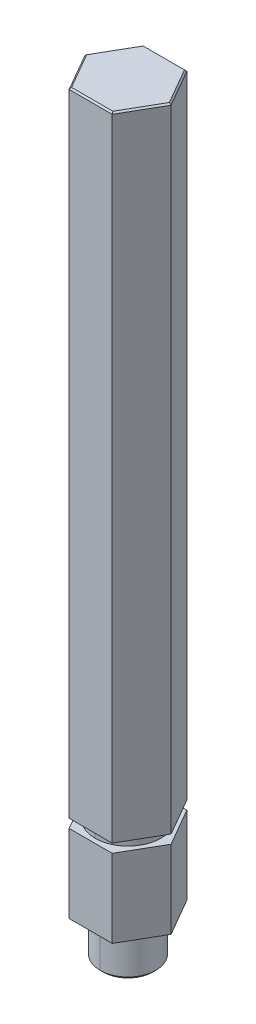
ISO-10303-21;
HEADER;
FILE_DESCRIPTION(('STEP AP214'),'2;1');
FILE_NAME('part.step','',(''),(''),'','','');
FILE_SCHEMA(('AUTOMOTIVE_DESIGN { 1 0 10303 214 1 1 1 1 }'));
ENDSEC;
DATA;
#1=APPLICATION_CONTEXT('core data for automotive mechanical design processes');
#2=APPLICATION_PROTOCOL_DEFINITION('international standard','automotive_design',2000,#1);
#3=PRODUCT_CONTEXT('',#1,'mechanical');
#4=PRODUCT('Part','Part','',(#3));
#5=PRODUCT_RELATED_PRODUCT_CATEGORY('part','',(#4));
#6=PRODUCT_DEFINITION_FORMATION('','',#4);
#7=PRODUCT_DEFINITION_CONTEXT('part definition',#1,'design');
#8=PRODUCT_DEFINITION('design','',#6,#7);
#9=PRODUCT_DEFINITION_SHAPE('','',#8);
#10=(LENGTH_UNIT() NAMED_UNIT(*) SI_UNIT(.MILLI.,.METRE.));
#11=(NAMED_UNIT(*) PLANE_ANGLE_UNIT() SI_UNIT($,.RADIAN.));
#12=(NAMED_UNIT(*) SI_UNIT($,.STERADIAN.) SOLID_ANGLE_UNIT());
#13=UNCERTAINTY_MEASURE_WITH_UNIT(LENGTH_MEASURE(1.E-05),#10,'distance_accuracy_value','');
#14=(GEOMETRIC_REPRESENTATION_CONTEXT(3) GLOBAL_UNCERTAINTY_ASSIGNED_CONTEXT((#13)) GLOBAL_UNIT_ASSIGNED_CONTEXT((#10,
#11,#12)) REPRESENTATION_CONTEXT('',''));
#15=CARTESIAN_POINT('',(0.,0.,0.));
#16=DIRECTION('',(0.,0.,1.));
#17=DIRECTION('',(1.,0.,0.));
#18=AXIS2_PLACEMENT_3D('',#15,#16,#17);
#19=CARTESIAN_POINT('',(-38.3071337161431,-32.258,-16.669011646302));
#20=DIRECTION('',(0.,-1.,0.));
#21=DIRECTION('',(0.,0.,-1.));
#22=AXIS2_PLACEMENT_3D('',#19,#20,#21);
#23=CONICAL_SURFACE('',#22,3.1623,0.78539816339744);
#24=DIRECTION('',(0.,-0.707106781186554,0.707106781186542));
#25=VECTOR('',#24,1.);
#26=CARTESIAN_POINT('',(-38.3071337161431,-32.258,-13.506711646302));
#27=LINE('',#26,#25);
#28=CARTESIAN_POINT('',(-38.3071337161431,-32.258,-13.506711646302));
#29=VERTEX_POINT('',#28);
#30=CARTESIAN_POINT('',(-38.3071337161431,-32.512,-13.252711646302));
#31=VERTEX_POINT('',#30);
#32=EDGE_CURVE('E396',#29,#31,#27,.T.);
#33=ORIENTED_EDGE('',*,*,#32,.F.);
#34=CARTESIAN_POINT('',(-38.3071337161431,-32.258,-16.669011646302));
#35=DIRECTION('',(0.,-1.,0.));
#36=DIRECTION('',(0.,0.,1.));
#37=AXIS2_PLACEMENT_3D('',#34,#35,#36);
#38=CIRCLE('',#37,3.1623);
#39=CARTESIAN_POINT('',(-38.3071337161431,-32.258,-19.831311646302));
#40=VERTEX_POINT('',#39);
#41=EDGE_CURVE('E380',#40,#29,#38,.T.);
#42=ORIENTED_EDGE('',*,*,#41,.F.);
#43=DIRECTION('',(0.,-0.707106781186554,-0.707106781186542));
#44=VECTOR('',#43,1.);
#45=CARTESIAN_POINT('',(-38.3071337161431,-32.258,-19.831311646302));
#46=LINE('',#45,#44);
#47=CARTESIAN_POINT('',(-38.3071337161431,-32.512,-20.085311646302));
#48=VERTEX_POINT('',#47);
#49=EDGE_CURVE('E311',#40,#48,#46,.T.);
#50=ORIENTED_EDGE('',*,*,#49,.T.);
#51=CARTESIAN_POINT('',(-38.3071337161431,-32.512,-16.669011646302));
#52=DIRECTION('',(0.,1.,0.));
#53=DIRECTION('',(0.,0.,1.));
#54=AXIS2_PLACEMENT_3D('',#51,#52,#53);
#55=CIRCLE('',#54,3.4163);
#56=EDGE_CURVE('E21',#31,#48,#55,.T.);
#57=ORIENTED_EDGE('',*,*,#56,.F.);
#58=EDGE_LOOP('',(#33,#42,#50,#57));
#59=FACE_BOUND('',#58,.T.);
#60=ADVANCED_FACE('F17',(#59),#23,.F.);
#61=CARTESIAN_POINT('',(-38.3071337161451,97.08134,-10.573011646302));
#62=DIRECTION('',(0.,-0.707106781186532,-0.707106781186563));
#63=DIRECTION('',(0.,-0.707106781186563,0.707106781186532));
#64=AXIS2_PLACEMENT_3D('',#61,#62,#63);
#65=PLANE('',#64);
#66=DIRECTION('',(-0.377964473009236,-0.654653670707989,0.65465367070796));
#67=VECTOR('',#66,1.);
#68=CARTESIAN_POINT('',(-41.3238713512686,97.9521971428579,-11.4438687891595));
#69=LINE('',#68,#67);
#70=CARTESIAN_POINT('',(-41.8266609571231,97.08134,-10.573011646302));
#71=VERTEX_POINT('',#70);
#72=CARTESIAN_POINT('',(-41.9733079254973,96.82734,-10.319011646302));
#73=VERTEX_POINT('',#72);
#74=EDGE_CURVE('E28',#71,#73,#69,.T.);
#75=ORIENTED_EDGE('',*,*,#74,.T.);
#76=DIRECTION('',(-1.,0.,0.));
#77=VECTOR('',#76,1.);
#78=CARTESIAN_POINT('',(-41.9733079254972,96.82734,-10.319011646302));
#79=LINE('',#78,#77);
#80=CARTESIAN_POINT('',(-34.640959506789,96.82734,-10.319011646302));
#81=VERTEX_POINT('',#80);
#82=EDGE_CURVE('E334',#81,#73,#79,.T.);
#83=ORIENTED_EDGE('',*,*,#82,.F.);
#84=DIRECTION('',(-0.377964473009216,0.654653670707995,-0.654653670707966));
#85=VECTOR('',#84,1.);
#86=CARTESIAN_POINT('',(-35.2903960810174,97.9521971428575,-11.443868789159));
#87=LINE('',#86,#85);
#88=CARTESIAN_POINT('',(-34.7876064751632,97.08134,-10.573011646302));
#89=VERTEX_POINT('',#88);
#90=EDGE_CURVE('E11',#81,#89,#87,.T.);
#91=ORIENTED_EDGE('',*,*,#90,.T.);
#92=DIRECTION('',(1.,0.,0.));
#93=VECTOR('',#92,1.);
#94=CARTESIAN_POINT('',(-38.3071337161451,97.08134,-10.573011646302));
#95=LINE('',#94,#93);
#96=EDGE_CURVE('E404',#71,#89,#95,.T.);
#97=ORIENTED_EDGE('',*,*,#96,.F.);
#98=EDGE_LOOP('',(#75,#83,#91,#97));
#99=FACE_BOUND('',#98,.T.);
#100=ADVANCED_FACE('F1010',(#99),#65,.F.);
#101=CARTESIAN_POINT('',(-33.0278428546735,97.08134,-13.6210116463016));
#102=DIRECTION('',(-0.61237243569581,-0.70710678118653,-0.353553390593283));
#103=DIRECTION('',(-0.755928946018438,0.654653670707996,0.));
#104=AXIS2_PLACEMENT_3D('',#101,#102,#103);
#105=PLANE('',#104);
#106=DIRECTION('',(-0.75592894601844,0.654653670707994,0.));
#107=VECTOR('',#106,1.);
#108=CARTESIAN_POINT('',(-32.2736584458919,97.9521971428577,-16.669011646302));
#109=LINE('',#108,#107);
#110=CARTESIAN_POINT('',(-30.9747852974349,96.82734,-16.669011646302));
#111=VERTEX_POINT('',#110);
#112=CARTESIAN_POINT('',(-31.2680792341833,97.08134,-16.669011646302));
#113=VERTEX_POINT('',#112);
#114=EDGE_CURVE('E286',#111,#113,#109,.T.);
#115=ORIENTED_EDGE('',*,*,#114,.T.);
#116=DIRECTION('',(0.5,0.,-0.866025403784438));
#117=VECTOR('',#116,1.);
#118=CARTESIAN_POINT('',(-33.0278428546735,97.08134,-13.6210116463016));
#119=LINE('',#118,#117);
#120=EDGE_CURVE('E298',#89,#113,#119,.T.);
#121=ORIENTED_EDGE('',*,*,#120,.F.);
#122=ORIENTED_EDGE('',*,*,#90,.F.);
#123=DIRECTION('',(-0.5,0.,0.866025403784438));
#124=VECTOR('',#123,1.);
#125=CARTESIAN_POINT('',(-34.640959506789,96.82734,-10.3190116463021));
#126=LINE('',#125,#124);
#127=EDGE_CURVE('E287',#111,#81,#126,.T.);
#128=ORIENTED_EDGE('',*,*,#127,.F.);
#129=EDGE_LOOP('',(#115,#121,#122,#128));
#130=FACE_BOUND('',#129,.T.);
#131=ADVANCED_FACE('F1000',(#130),#105,.F.);
#132=CARTESIAN_POINT('',(-43.5864245776138,97.08134,-13.6210116463033));
#133=DIRECTION('',(0.612372435695801,-0.707106781186541,-0.353553390593277));
#134=DIRECTION('',(0.,0.447213595499965,-0.894427190999912));
#135=AXIS2_PLACEMENT_3D('',#132,#133,#134);
#136=PLANE('',#135);
#137=DIRECTION('',(-0.755928946018446,-0.654653670707987,0.));
#138=VECTOR('',#137,1.);
#139=CARTESIAN_POINT('',(-44.3406089863946,97.9521971428575,-16.669011646302));
#140=LINE('',#139,#138);
#141=CARTESIAN_POINT('',(-45.346188198103,97.08134,-16.669011646302));
#142=VERTEX_POINT('',#141);
#143=CARTESIAN_POINT('',(-45.6394821348514,96.82734,-16.669011646302));
#144=VERTEX_POINT('',#143);
#145=EDGE_CURVE('E301',#142,#144,#140,.T.);
#146=ORIENTED_EDGE('',*,*,#145,.T.);
#147=DIRECTION('',(-0.5,0.,-0.866025403784438));
#148=VECTOR('',#147,1.);
#149=CARTESIAN_POINT('',(-45.6394821348514,96.82734,-16.669011646302));
#150=LINE('',#149,#148);
#151=EDGE_CURVE('E333',#73,#144,#150,.T.);
#152=ORIENTED_EDGE('',*,*,#151,.F.);
#153=ORIENTED_EDGE('',*,*,#74,.F.);
#154=DIRECTION('',(0.5,0.,0.866025403784439));
#155=VECTOR('',#154,1.);
#156=CARTESIAN_POINT('',(-43.5864245776138,97.08134,-13.6210116463033));
#157=LINE('',#156,#155);
#158=EDGE_CURVE('E375',#142,#71,#157,.T.);
#159=ORIENTED_EDGE('',*,*,#158,.F.);
#160=EDGE_LOOP('',(#146,#152,#153,#159));
#161=FACE_BOUND('',#160,.T.);
#162=ADVANCED_FACE('F991',(#161),#136,.F.);
#163=CARTESIAN_POINT('',(-33.0278428546739,97.08134,-19.7170116463032));
#164=DIRECTION('',(-0.612372435695806,-0.707106781186534,0.353553390593281));
#165=DIRECTION('',(-0.755928946018442,0.654653670707992,0.));
#166=AXIS2_PLACEMENT_3D('',#163,#164,#165);
#167=PLANE('',#166);
#168=DIRECTION('',(-0.37796447300921,0.654653670707988,0.654653670707976));
#169=VECTOR('',#168,1.);
#170=CARTESIAN_POINT('',(-35.2903960810172,97.9521971428573,-21.8941545034452));
#171=LINE('',#170,#169);
#172=CARTESIAN_POINT('',(-34.640959506789,96.82734,-23.019011646302));
#173=VERTEX_POINT('',#172);
#174=CARTESIAN_POINT('',(-34.7876064751632,97.08134,-22.765011646302));
#175=VERTEX_POINT('',#174);
#176=EDGE_CURVE('E379',#173,#175,#171,.T.);
#177=ORIENTED_EDGE('',*,*,#176,.T.);
#178=DIRECTION('',(-0.5,0.,-0.866025403784439));
#179=VECTOR('',#178,1.);
#180=CARTESIAN_POINT('',(-33.0278428546739,97.08134,-19.7170116463032));
#181=LINE('',#180,#179);
#182=EDGE_CURVE('E293',#113,#175,#181,.T.);
#183=ORIENTED_EDGE('',*,*,#182,.F.);
#184=ORIENTED_EDGE('',*,*,#114,.F.);
#185=DIRECTION('',(0.5,0.,0.866025403784438));
#186=VECTOR('',#185,1.);
#187=CARTESIAN_POINT('',(-30.9747852974349,96.82734,-16.669011646302));
#188=LINE('',#187,#186);
#189=EDGE_CURVE('E328',#173,#111,#188,.T.);
#190=ORIENTED_EDGE('',*,*,#189,.F.);
#191=EDGE_LOOP('',(#177,#183,#184,#190));
#192=FACE_BOUND('',#191,.T.);
#193=ADVANCED_FACE('F542',(#192),#167,.F.);
#194=CARTESIAN_POINT('',(-43.5864245776133,97.08134,-19.7170116463016));
#195=DIRECTION('',(0.612372435695805,-0.707106781186535,0.353553390593281));
#196=DIRECTION('',(0.,-0.447213595499972,-0.894427190999909));
#197=AXIS2_PLACEMENT_3D('',#194,#195,#196);
#198=PLANE('',#197);
#199=DIRECTION('',(-0.377964473009212,-0.654653670707987,-0.654653670707976));
#200=VECTOR('',#199,1.);
#201=CARTESIAN_POINT('',(-41.3238713512691,97.9521971428571,-21.8941545034453));
#202=LINE('',#201,#200);
#203=CARTESIAN_POINT('',(-41.8266609571231,97.08134,-22.765011646302));
#204=VERTEX_POINT('',#203);
#205=CARTESIAN_POINT('',(-41.9733079254973,96.82734,-23.019011646302));
#206=VERTEX_POINT('',#205);
#207=EDGE_CURVE('E43',#204,#206,#202,.T.);
#208=ORIENTED_EDGE('',*,*,#207,.T.);
#209=DIRECTION('',(0.5,0.,-0.866025403784438));
#210=VECTOR('',#209,1.);
#211=CARTESIAN_POINT('',(-41.9733079254972,96.82734,-23.0190116463021));
#212=LINE('',#211,#210);
#213=EDGE_CURVE('E340',#144,#206,#212,.T.);
#214=ORIENTED_EDGE('',*,*,#213,.F.);
#215=ORIENTED_EDGE('',*,*,#145,.F.);
#216=DIRECTION('',(-0.5,0.,0.866025403784439));
#217=VECTOR('',#216,1.);
#218=CARTESIAN_POINT('',(-43.5864245776133,97.08134,-19.7170116463016));
#219=LINE('',#218,#217);
#220=EDGE_CURVE('E410',#204,#142,#219,.T.);
#221=ORIENTED_EDGE('',*,*,#220,.F.);
#222=EDGE_LOOP('',(#208,#214,#215,#221));
#223=FACE_BOUND('',#222,.T.);
#224=ADVANCED_FACE('F472',(#223),#198,.F.);
#225=CARTESIAN_POINT('',(-38.3071337161451,97.08134,-22.7650116463019));
#226=DIRECTION('',(0.,-0.707106781186542,0.707106781186554));
#227=DIRECTION('',(-1.,0.,0.));
#228=AXIS2_PLACEMENT_3D('',#225,#226,#227);
#229=PLANE('',#228);
#230=ORIENTED_EDGE('',*,*,#176,.F.);
#231=DIRECTION('',(1.,0.,0.));
#232=VECTOR('',#231,1.);
#233=CARTESIAN_POINT('',(-34.640959506789,96.82734,-23.019011646302));
#234=LINE('',#233,#232);
#235=EDGE_CURVE('E339',#206,#173,#234,.T.);
#236=ORIENTED_EDGE('',*,*,#235,.F.);
#237=ORIENTED_EDGE('',*,*,#207,.F.);
#238=DIRECTION('',(-1.,0.,0.));
#239=VECTOR('',#238,1.);
#240=CARTESIAN_POINT('',(-38.3071337161451,97.08134,-22.765011646302));
#241=LINE('',#240,#239);
#242=EDGE_CURVE('E297',#175,#204,#241,.T.);
#243=ORIENTED_EDGE('',*,*,#242,.F.);
#244=EDGE_LOOP('',(#230,#236,#237,#243));
#245=FACE_BOUND('',#244,.T.);
#246=ADVANCED_FACE('F476',(#245),#229,.F.);
#247=CARTESIAN_POINT('',(-38.3071337161431,-19.812,-16.669011646302));
#248=DIRECTION('',(0.,-1.,0.));
#249=DIRECTION('',(0.,0.,-1.));
#250=AXIS2_PLACEMENT_3D('',#247,#248,#249);
#251=PLANE('',#250);
#252=CARTESIAN_POINT('',(-38.3071337161431,-19.812,-16.669011646302));
#253=DIRECTION('',(0.,-1.,0.));
#254=DIRECTION('',(0.,0.,-1.));
#255=AXIS2_PLACEMENT_3D('',#252,#253,#254);
#256=CIRCLE('',#255,3.1623);
#257=CARTESIAN_POINT('',(-38.3071337161431,-19.812,-13.506711646302));
#258=VERTEX_POINT('',#257);
#259=CARTESIAN_POINT('',(-38.3071337161431,-19.812,-19.831311646302));
#260=VERTEX_POINT('',#259);
#261=EDGE_CURVE('E255',#258,#260,#256,.T.);
#262=ORIENTED_EDGE('',*,*,#261,.T.);
#263=CARTESIAN_POINT('',(-38.3071337161431,-19.812,-16.669011646302));
#264=DIRECTION('',(0.,-1.,0.));
#265=DIRECTION('',(0.,0.,-1.));
#266=AXIS2_PLACEMENT_3D('',#263,#264,#265);
#267=CIRCLE('',#266,3.1623);
#268=EDGE_CURVE('E376',#260,#258,#267,.T.);
#269=ORIENTED_EDGE('',*,*,#268,.T.);
#270=EDGE_LOOP('',(#262,#269));
#271=FACE_BOUND('',#270,.T.);
#272=ADVANCED_FACE('F956',(#271),#251,.T.);
#273=CARTESIAN_POINT('',(-38.3071337161431,-45.212,-16.669011646302));
#274=DIRECTION('',(0.,1.,0.));
#275=DIRECTION('',(0.,0.,1.));
#276=AXIS2_PLACEMENT_3D('',#273,#274,#275);
#277=CYLINDRICAL_SURFACE('',#276,3.1623);
#278=DIRECTION('',(0.,1.,0.));
#279=VECTOR('',#278,1.);
#280=CARTESIAN_POINT('',(-38.3071337161431,-45.212,-19.831311646302));
#281=LINE('',#280,#279);
#282=EDGE_CURVE('E307',#40,#260,#281,.T.);
#283=ORIENTED_EDGE('',*,*,#282,.F.);
#284=ORIENTED_EDGE('',*,*,#41,.T.);
#285=DIRECTION('',(0.,1.,0.));
#286=VECTOR('',#285,1.);
#287=CARTESIAN_POINT('',(-38.3071337161431,-45.212,-13.506711646302));
#288=LINE('',#287,#286);
#289=EDGE_CURVE('E250',#29,#258,#288,.T.);
#290=ORIENTED_EDGE('',*,*,#289,.T.);
#291=ORIENTED_EDGE('',*,*,#268,.F.);
#292=EDGE_LOOP('',(#283,#284,#290,#291));
#293=FACE_BOUND('',#292,.T.);
#294=ADVANCED_FACE('F947',(#293),#277,.F.);
#295=CARTESIAN_POINT('',(-38.3071337161451,97.08134,-16.6690116463025));
#296=DIRECTION('',(0.,1.,0.));
#297=DIRECTION('',(0.,0.,-1.));
#298=AXIS2_PLACEMENT_3D('',#295,#296,#297);
#299=PLANE('',#298);
#300=ORIENTED_EDGE('',*,*,#158,.T.);
#301=ORIENTED_EDGE('',*,*,#96,.T.);
#302=ORIENTED_EDGE('',*,*,#120,.T.);
#303=ORIENTED_EDGE('',*,*,#182,.T.);
#304=ORIENTED_EDGE('',*,*,#242,.T.);
#305=ORIENTED_EDGE('',*,*,#220,.T.);
#306=EDGE_LOOP('',(#300,#301,#302,#303,#304,#305));
#307=FACE_BOUND('',#306,.T.);
#308=ADVANCED_FACE('F537',(#307),#299,.T.);
#309=CARTESIAN_POINT('',(-45.6394821348514,-25.4,-16.669011646302));
#310=DIRECTION('',(-0.866025403784439,0.,0.5));
#311=DIRECTION('',(0.,1.,0.));
#312=AXIS2_PLACEMENT_3D('',#309,#310,#311);
#313=PLANE('',#312);
#314=DIRECTION('',(0.,1.,0.));
#315=VECTOR('',#314,1.);
#316=CARTESIAN_POINT('',(-41.9733079254973,-25.4,-10.319011646302));
#317=LINE('',#316,#315);
#318=CARTESIAN_POINT('',(-41.9733079254973,-10.6172,-10.319011646302));
#319=VERTEX_POINT('',#318);
#320=EDGE_CURVE('E329',#319,#73,#317,.T.);
#321=ORIENTED_EDGE('',*,*,#320,.T.);
#322=ORIENTED_EDGE('',*,*,#151,.T.);
#323=DIRECTION('',(0.,1.,0.));
#324=VECTOR('',#323,1.);
#325=CARTESIAN_POINT('',(-45.6394821348514,-25.4,-16.669011646302));
#326=LINE('',#325,#324);
#327=CARTESIAN_POINT('',(-45.6394821348514,-10.6172,-16.669011646302));
#328=VERTEX_POINT('',#327);
#329=EDGE_CURVE('E282',#328,#144,#326,.T.);
#330=ORIENTED_EDGE('',*,*,#329,.F.);
#331=DIRECTION('',(-0.5,0.,-0.866025403784438));
#332=VECTOR('',#331,1.);
#333=CARTESIAN_POINT('',(-45.6394821348514,-10.6172,-16.669011646302));
#334=LINE('',#333,#332);
#335=EDGE_CURVE('E248',#319,#328,#334,.T.);
#336=ORIENTED_EDGE('',*,*,#335,.F.);
#337=EDGE_LOOP('',(#321,#322,#330,#336));
#338=FACE_BOUND('',#337,.T.);
#339=ADVANCED_FACE('F929',(#338),#313,.T.);
#340=CARTESIAN_POINT('',(-41.9733079254973,-25.4,-10.319011646302));
#341=DIRECTION('',(0.,0.,1.));
#342=DIRECTION('',(1.,0.,0.));
#343=AXIS2_PLACEMENT_3D('',#340,#341,#342);
#344=PLANE('',#343);
#345=DIRECTION('',(0.,1.,0.));
#346=VECTOR('',#345,1.);
#347=CARTESIAN_POINT('',(-34.640959506789,-25.4,-10.319011646302));
#348=LINE('',#347,#346);
#349=CARTESIAN_POINT('',(-34.640959506789,-10.6172,-10.319011646302));
#350=VERTEX_POINT('',#349);
#351=EDGE_CURVE('E291',#350,#81,#348,.T.);
#352=ORIENTED_EDGE('',*,*,#351,.T.);
#353=ORIENTED_EDGE('',*,*,#82,.T.);
#354=ORIENTED_EDGE('',*,*,#320,.F.);
#355=DIRECTION('',(-1.,0.,0.));
#356=VECTOR('',#355,1.);
#357=CARTESIAN_POINT('',(-41.9733079254973,-10.6172,-10.319011646302));
#358=LINE('',#357,#356);
#359=EDGE_CURVE('E316',#350,#319,#358,.T.);
#360=ORIENTED_EDGE('',*,*,#359,.F.);
#361=EDGE_LOOP('',(#352,#353,#354,#360));
#362=FACE_BOUND('',#361,.T.);
#363=ADVANCED_FACE('F919',(#362),#344,.T.);
#364=CARTESIAN_POINT('',(-34.640959506789,-25.4,-10.319011646302));
#365=DIRECTION('',(0.866025403784438,0.,0.5));
#366=DIRECTION('',(0.,-1.,0.));
#367=AXIS2_PLACEMENT_3D('',#364,#365,#366);
#368=PLANE('',#367);
#369=DIRECTION('',(0.,1.,0.));
#370=VECTOR('',#369,1.);
#371=CARTESIAN_POINT('',(-30.9747852974349,-25.4,-16.669011646302));
#372=LINE('',#371,#370);
#373=CARTESIAN_POINT('',(-30.9747852974349,-10.6172,-16.669011646302));
#374=VERTEX_POINT('',#373);
#375=EDGE_CURVE('E292',#374,#111,#372,.T.);
#376=ORIENTED_EDGE('',*,*,#375,.T.);
#377=ORIENTED_EDGE('',*,*,#127,.T.);
#378=ORIENTED_EDGE('',*,*,#351,.F.);
#379=DIRECTION('',(-0.5,0.,0.866025403784438));
#380=VECTOR('',#379,1.);
#381=CARTESIAN_POINT('',(-34.640959506789,-10.6172,-10.319011646302));
#382=LINE('',#381,#380);
#383=EDGE_CURVE('E320',#374,#350,#382,.T.);
#384=ORIENTED_EDGE('',*,*,#383,.F.);
#385=EDGE_LOOP('',(#376,#377,#378,#384));
#386=FACE_BOUND('',#385,.T.);
#387=ADVANCED_FACE('F909',(#386),#368,.T.);
#388=CARTESIAN_POINT('',(-30.9747852974349,-25.4,-16.669011646302));
#389=DIRECTION('',(0.866025403784439,0.,-0.5));
#390=DIRECTION('',(0.,-1.,0.));
#391=AXIS2_PLACEMENT_3D('',#388,#389,#390);
#392=PLANE('',#391);
#393=DIRECTION('',(0.,1.,0.));
#394=VECTOR('',#393,1.);
#395=CARTESIAN_POINT('',(-34.640959506789,-25.4,-23.019011646302));
#396=LINE('',#395,#394);
#397=CARTESIAN_POINT('',(-34.640959506789,-10.6172,-23.019011646302));
#398=VERTEX_POINT('',#397);
#399=EDGE_CURVE('E341',#398,#173,#396,.T.);
#400=ORIENTED_EDGE('',*,*,#399,.T.);
#401=ORIENTED_EDGE('',*,*,#189,.T.);
#402=ORIENTED_EDGE('',*,*,#375,.F.);
#403=DIRECTION('',(0.5,0.,0.866025403784438));
#404=VECTOR('',#403,1.);
#405=CARTESIAN_POINT('',(-30.9747852974349,-10.6172,-16.669011646302));
#406=LINE('',#405,#404);
#407=EDGE_CURVE('E324',#398,#374,#406,.T.);
#408=ORIENTED_EDGE('',*,*,#407,.F.);
#409=EDGE_LOOP('',(#400,#401,#402,#408));
#410=FACE_BOUND('',#409,.T.);
#411=ADVANCED_FACE('F546',(#410),#392,.T.);
#412=CARTESIAN_POINT('',(-34.640959506789,-25.4,-23.019011646302));
#413=DIRECTION('',(0.,0.,-1.));
#414=DIRECTION('',(0.,-1.,0.));
#415=AXIS2_PLACEMENT_3D('',#412,#413,#414);
#416=PLANE('',#415);
#417=DIRECTION('',(0.,1.,0.));
#418=VECTOR('',#417,1.);
#419=CARTESIAN_POINT('',(-41.9733079254973,-25.4,-23.019011646302));
#420=LINE('',#419,#418);
#421=CARTESIAN_POINT('',(-41.9733079254973,-10.6172,-23.019011646302));
#422=VERTEX_POINT('',#421);
#423=EDGE_CURVE('E335',#422,#206,#420,.T.);
#424=ORIENTED_EDGE('',*,*,#423,.T.);
#425=ORIENTED_EDGE('',*,*,#235,.T.);
#426=ORIENTED_EDGE('',*,*,#399,.F.);
#427=DIRECTION('',(1.,0.,0.));
#428=VECTOR('',#427,1.);
#429=CARTESIAN_POINT('',(-34.640959506789,-10.6172,-23.019011646302));
#430=LINE('',#429,#428);
#431=EDGE_CURVE('E275',#422,#398,#430,.T.);
#432=ORIENTED_EDGE('',*,*,#431,.F.);
#433=EDGE_LOOP('',(#424,#425,#426,#432));
#434=FACE_BOUND('',#433,.T.);
#435=ADVANCED_FACE('F482',(#434),#416,.T.);
#436=CARTESIAN_POINT('',(-41.9733079254973,-25.4,-23.019011646302));
#437=DIRECTION('',(-0.866025403784439,0.,-0.5));
#438=DIRECTION('',(-0.5,0.,0.866025403784439));
#439=AXIS2_PLACEMENT_3D('',#436,#437,#438);
#440=PLANE('',#439);
#441=ORIENTED_EDGE('',*,*,#329,.T.);
#442=ORIENTED_EDGE('',*,*,#213,.T.);
#443=ORIENTED_EDGE('',*,*,#423,.F.);
#444=DIRECTION('',(0.5,0.,-0.866025403784438));
#445=VECTOR('',#444,1.);
#446=CARTESIAN_POINT('',(-41.9733079254973,-10.6172,-23.019011646302));
#447=LINE('',#446,#445);
#448=EDGE_CURVE('E271',#328,#422,#447,.T.);
#449=ORIENTED_EDGE('',*,*,#448,.F.);
#450=EDGE_LOOP('',(#441,#442,#443,#449));
#451=FACE_BOUND('',#450,.T.);
#452=ADVANCED_FACE('F485',(#451),#440,.T.);
#453=CARTESIAN_POINT('',(-21.7881364409388,-12.1158,-16.669011646302));
#454=DIRECTION('',(0.,-1.,0.));
#455=DIRECTION('',(0.,0.,-1.));
#456=AXIS2_PLACEMENT_3D('',#453,#454,#455);
#457=PLANE('',#456);
#458=CARTESIAN_POINT('',(-38.3071337161431,-12.1158,-16.669011646302));
#459=DIRECTION('',(0.,1.,0.));
#460=DIRECTION('',(0.,0.,1.));
#461=AXIS2_PLACEMENT_3D('',#458,#459,#460);
#462=CIRCLE('',#461,5.588);
#463=CARTESIAN_POINT('',(-38.3071337161431,-12.1158,-11.081011646302));
#464=VERTEX_POINT('',#463);
#465=CARTESIAN_POINT('',(-38.3071337161431,-12.1158,-22.2570116463021));
#466=VERTEX_POINT('',#465);
#467=EDGE_CURVE('E254',#464,#466,#462,.T.);
#468=ORIENTED_EDGE('',*,*,#467,.F.);
#469=CARTESIAN_POINT('',(-38.3071337161431,-12.1158,-16.669011646302));
#470=DIRECTION('',(0.,1.,0.));
#471=DIRECTION('',(0.,0.,1.));
#472=AXIS2_PLACEMENT_3D('',#469,#470,#471);
#473=CIRCLE('',#472,5.588);
#474=EDGE_CURVE('E81',#466,#464,#473,.T.);
#475=ORIENTED_EDGE('',*,*,#474,.F.);
#476=EDGE_LOOP('',(#468,#475));
#477=FACE_BOUND('',#476,.T.);
#478=DIRECTION('',(0.5,0.,0.866025403784438));
#479=VECTOR('',#478,1.);
#480=CARTESIAN_POINT('',(-45.6394821348514,-12.1158,-16.669011646302));
#481=LINE('',#480,#479);
#482=CARTESIAN_POINT('',(-45.6394821348514,-12.1158,-16.669011646302));
#483=VERTEX_POINT('',#482);
#484=CARTESIAN_POINT('',(-41.9733079254973,-12.1158,-10.319011646302));
#485=VERTEX_POINT('',#484);
#486=EDGE_CURVE('E412',#483,#485,#481,.T.);
#487=ORIENTED_EDGE('',*,*,#486,.T.);
#488=DIRECTION('',(1.,0.,0.));
#489=VECTOR('',#488,1.);
#490=CARTESIAN_POINT('',(-41.9733079254973,-12.1158,-10.319011646302));
#491=LINE('',#490,#489);
#492=CARTESIAN_POINT('',(-34.640959506789,-12.1158,-10.319011646302));
#493=VERTEX_POINT('',#492);
#494=EDGE_CURVE('E348',#485,#493,#491,.T.);
#495=ORIENTED_EDGE('',*,*,#494,.T.);
#496=DIRECTION('',(0.5,0.,-0.866025403784438));
#497=VECTOR('',#496,1.);
#498=CARTESIAN_POINT('',(-34.640959506789,-12.1158,-10.319011646302));
#499=LINE('',#498,#497);
#500=CARTESIAN_POINT('',(-30.9747852974349,-12.1158,-16.669011646302));
#501=VERTEX_POINT('',#500);
#502=EDGE_CURVE('E399',#493,#501,#499,.T.);
#503=ORIENTED_EDGE('',*,*,#502,.T.);
#504=DIRECTION('',(-0.5,0.,-0.866025403784438));
#505=VECTOR('',#504,1.);
#506=CARTESIAN_POINT('',(-30.9747852974349,-12.1158,-16.669011646302));
#507=LINE('',#506,#505);
#508=CARTESIAN_POINT('',(-34.640959506789,-12.1158,-23.019011646302));
#509=VERTEX_POINT('',#508);
#510=EDGE_CURVE('E239',#501,#509,#507,.T.);
#511=ORIENTED_EDGE('',*,*,#510,.T.);
#512=DIRECTION('',(-1.,0.,0.));
#513=VECTOR('',#512,1.);
#514=CARTESIAN_POINT('',(-34.640959506789,-12.1158,-23.019011646302));
#515=LINE('',#514,#513);
#516=CARTESIAN_POINT('',(-41.9733079254973,-12.1158,-23.019011646302));
#517=VERTEX_POINT('',#516);
#518=EDGE_CURVE('E224',#509,#517,#515,.T.);
#519=ORIENTED_EDGE('',*,*,#518,.T.);
#520=DIRECTION('',(-0.5,0.,0.866025403784438));
#521=VECTOR('',#520,1.);
#522=CARTESIAN_POINT('',(-41.9733079254973,-12.1158,-23.019011646302));
#523=LINE('',#522,#521);
#524=EDGE_CURVE('E315',#517,#483,#523,.T.);
#525=ORIENTED_EDGE('',*,*,#524,.T.);
#526=EDGE_LOOP('',(#487,#495,#503,#511,#519,#525));
#527=FACE_BOUND('',#526,.T.);
#528=ADVANCED_FACE('F439',(#477,#527),#457,.F.);
#529=CARTESIAN_POINT('',(-32.7191337161431,-10.6172,-16.669011646302));
#530=DIRECTION('',(0.,1.,0.));
#531=DIRECTION('',(1.,0.,0.));
#532=AXIS2_PLACEMENT_3D('',#529,#530,#531);
#533=PLANE('',#532);
#534=CARTESIAN_POINT('',(-38.3071337161431,-10.6172,-16.669011646302));
#535=DIRECTION('',(0.,1.,0.));
#536=DIRECTION('',(0.,0.,1.));
#537=AXIS2_PLACEMENT_3D('',#534,#535,#536);
#538=CIRCLE('',#537,5.588);
#539=CARTESIAN_POINT('',(-38.3071337161431,-10.6172,-11.081011646302));
#540=VERTEX_POINT('',#539);
#541=CARTESIAN_POINT('',(-38.3071337161431,-10.6172,-22.2570116463021));
#542=VERTEX_POINT('',#541);
#543=EDGE_CURVE('E358',#540,#542,#538,.T.);
#544=ORIENTED_EDGE('',*,*,#543,.T.);
#545=CARTESIAN_POINT('',(-38.3071337161431,-10.6172,-16.669011646302));
#546=DIRECTION('',(0.,1.,0.));
#547=DIRECTION('',(0.,0.,1.));
#548=AXIS2_PLACEMENT_3D('',#545,#546,#547);
#549=CIRCLE('',#548,5.588);
#550=EDGE_CURVE('E347',#542,#540,#549,.T.);
#551=ORIENTED_EDGE('',*,*,#550,.T.);
#552=EDGE_LOOP('',(#544,#551));
#553=FACE_BOUND('',#552,.T.);
#554=ORIENTED_EDGE('',*,*,#407,.T.);
#555=ORIENTED_EDGE('',*,*,#383,.T.);
#556=ORIENTED_EDGE('',*,*,#359,.T.);
#557=ORIENTED_EDGE('',*,*,#335,.T.);
#558=ORIENTED_EDGE('',*,*,#448,.T.);
#559=ORIENTED_EDGE('',*,*,#431,.T.);
#560=EDGE_LOOP('',(#554,#555,#556,#557,#558,#559));
#561=FACE_BOUND('',#560,.T.);
#562=ADVANCED_FACE('F548',(#553,#561),#533,.F.);
#563=CARTESIAN_POINT('',(-38.3071337161431,-25.4,-16.669011646302));
#564=DIRECTION('',(0.,1.,0.));
#565=DIRECTION('',(0.,0.,1.));
#566=AXIS2_PLACEMENT_3D('',#563,#564,#565);
#567=CYLINDRICAL_SURFACE('',#566,5.588);
#568=DIRECTION('',(0.,1.,0.));
#569=VECTOR('',#568,1.);
#570=CARTESIAN_POINT('',(-38.3071337161431,-25.4,-22.2570116463021));
#571=LINE('',#570,#569);
#572=EDGE_CURVE('E354',#466,#542,#571,.T.);
#573=ORIENTED_EDGE('',*,*,#572,.F.);
#574=ORIENTED_EDGE('',*,*,#474,.T.);
#575=DIRECTION('',(0.,1.,0.));
#576=VECTOR('',#575,1.);
#577=CARTESIAN_POINT('',(-38.3071337161431,-25.4,-11.081011646302));
#578=LINE('',#577,#576);
#579=EDGE_CURVE('E306',#464,#540,#578,.T.);
#580=ORIENTED_EDGE('',*,*,#579,.T.);
#581=ORIENTED_EDGE('',*,*,#550,.F.);
#582=EDGE_LOOP('',(#573,#574,#580,#581));
#583=FACE_BOUND('',#582,.T.);
#584=ADVANCED_FACE('F855',(#583),#567,.T.);
#585=CARTESIAN_POINT('',(-38.3071337161431,-32.004,-16.669011646302));
#586=DIRECTION('',(0.,1.,0.));
#587=DIRECTION('',(0.,0.,1.));
#588=AXIS2_PLACEMENT_3D('',#585,#586,#587);
#589=CONICAL_SURFACE('',#588,4.7498,0.785398163397443);
#590=DIRECTION('',(0.,0.707106781186551,-0.707106781186544));
#591=VECTOR('',#590,1.);
#592=CARTESIAN_POINT('',(-38.3071337161431,-32.004,-21.418811646302));
#593=LINE('',#592,#591);
#594=CARTESIAN_POINT('',(-38.3071337161431,-32.512,-20.910811646302));
#595=VERTEX_POINT('',#594);
#596=CARTESIAN_POINT('',(-38.3071337161431,-32.004,-21.418811646302));
#597=VERTEX_POINT('',#596);
#598=EDGE_CURVE('E265',#595,#597,#593,.T.);
#599=ORIENTED_EDGE('',*,*,#598,.F.);
#600=CARTESIAN_POINT('',(-38.3071337161431,-32.512,-16.669011646302));
#601=DIRECTION('',(0.,-1.,0.));
#602=DIRECTION('',(0.,0.,1.));
#603=AXIS2_PLACEMENT_3D('',#600,#601,#602);
#604=CIRCLE('',#603,4.2418);
#605=CARTESIAN_POINT('',(-38.3071337161431,-32.512,-12.427211646302));
#606=VERTEX_POINT('',#605);
#607=EDGE_CURVE('E256',#606,#595,#604,.T.);
#608=ORIENTED_EDGE('',*,*,#607,.F.);
#609=DIRECTION('',(0.,0.707106781186551,0.707106781186544));
#610=VECTOR('',#609,1.);
#611=CARTESIAN_POINT('',(-38.3071337161431,-32.004,-11.919211646302));
#612=LINE('',#611,#610);
#613=CARTESIAN_POINT('',(-38.3071337161431,-32.004,-11.919211646302));
#614=VERTEX_POINT('',#613);
#615=EDGE_CURVE('E264',#606,#614,#612,.T.);
#616=ORIENTED_EDGE('',*,*,#615,.T.);
#617=CARTESIAN_POINT('',(-38.3071337161431,-32.004,-16.669011646302));
#618=DIRECTION('',(0.,1.,0.));
#619=DIRECTION('',(0.,0.,1.));
#620=AXIS2_PLACEMENT_3D('',#617,#618,#619);
#621=CIRCLE('',#620,4.7498);
#622=EDGE_CURVE('E259',#597,#614,#621,.T.);
#623=ORIENTED_EDGE('',*,*,#622,.F.);
#624=EDGE_LOOP('',(#599,#608,#616,#623));
#625=FACE_BOUND('',#624,.T.);
#626=ADVANCED_FACE('F843',(#625),#589,.T.);
#627=CARTESIAN_POINT('',(-38.3071337161431,-32.512,-16.669011646302));
#628=DIRECTION('',(0.,1.,0.));
#629=DIRECTION('',(1.,0.,0.));
#630=AXIS2_PLACEMENT_3D('',#627,#628,#629);
#631=PLANE('',#630);
#632=CARTESIAN_POINT('',(-38.3071337161431,-32.512,-16.669011646302));
#633=DIRECTION('',(0.,1.,0.));
#634=DIRECTION('',(0.,0.,1.));
#635=AXIS2_PLACEMENT_3D('',#632,#633,#634);
#636=CIRCLE('',#635,3.4163);
#637=EDGE_CURVE('E423',#48,#31,#636,.T.);
#638=ORIENTED_EDGE('',*,*,#637,.T.);
#639=ORIENTED_EDGE('',*,*,#56,.T.);
#640=EDGE_LOOP('',(#638,#639));
#641=FACE_BOUND('',#640,.T.);
#642=ORIENTED_EDGE('',*,*,#607,.T.);
#643=CARTESIAN_POINT('',(-38.3071337161431,-32.512,-16.669011646302));
#644=DIRECTION('',(0.,-1.,0.));
#645=DIRECTION('',(0.,0.,1.));
#646=AXIS2_PLACEMENT_3D('',#643,#644,#645);
#647=CIRCLE('',#646,4.2418);
#648=EDGE_CURVE('E302',#595,#606,#647,.T.);
#649=ORIENTED_EDGE('',*,*,#648,.T.);
#650=EDGE_LOOP('',(#642,#649));
#651=FACE_BOUND('',#650,.T.);
#652=ADVANCED_FACE('F832',(#641,#651),#631,.F.);
#653=CARTESIAN_POINT('',(-38.3071337161431,-32.512,-16.669011646302));
#654=DIRECTION('',(0.,1.,0.));
#655=DIRECTION('',(0.,0.,1.));
#656=AXIS2_PLACEMENT_3D('',#653,#654,#655);
#657=CYLINDRICAL_SURFACE('',#656,4.7498);
#658=DIRECTION('',(0.,1.,0.));
#659=VECTOR('',#658,1.);
#660=CARTESIAN_POINT('',(-38.3071337161431,-32.512,-21.418811646302));
#661=LINE('',#660,#659);
#662=CARTESIAN_POINT('',(-38.3071337161431,-25.4,-21.418811646302));
#663=VERTEX_POINT('',#662);
#664=EDGE_CURVE('E266',#597,#663,#661,.T.);
#665=ORIENTED_EDGE('',*,*,#664,.F.);
#666=ORIENTED_EDGE('',*,*,#622,.T.);
#667=DIRECTION('',(0.,1.,0.));
#668=VECTOR('',#667,1.);
#669=CARTESIAN_POINT('',(-38.3071337161431,-32.512,-11.919211646302));
#670=LINE('',#669,#668);
#671=CARTESIAN_POINT('',(-38.3071337161431,-25.4,-11.919211646302));
#672=VERTEX_POINT('',#671);
#673=EDGE_CURVE('E416',#614,#672,#670,.T.);
#674=ORIENTED_EDGE('',*,*,#673,.T.);
#675=CARTESIAN_POINT('',(-38.3071337161431,-25.4,-16.669011646302));
#676=DIRECTION('',(0.,1.,0.));
#677=DIRECTION('',(1.,0.,0.));
#678=AXIS2_PLACEMENT_3D('',#675,#676,#677);
#679=CIRCLE('',#678,4.7498);
#680=EDGE_CURVE('E314',#663,#672,#679,.T.);
#681=ORIENTED_EDGE('',*,*,#680,.F.);
#682=EDGE_LOOP('',(#665,#666,#674,#681));
#683=FACE_BOUND('',#682,.T.);
#684=ADVANCED_FACE('F820',(#683),#657,.T.);
#685=CARTESIAN_POINT('',(-38.3071337161431,-25.4,-3.96901164630201));
#686=DIRECTION('',(0.,1.,0.));
#687=DIRECTION('',(1.,0.,0.));
#688=AXIS2_PLACEMENT_3D('',#685,#686,#687);
#689=PLANE('',#688);
#690=CARTESIAN_POINT('',(-38.3071337161431,-25.4,-16.669011646302));
#691=DIRECTION('',(0.,1.,0.));
#692=DIRECTION('',(1.,0.,0.));
#693=AXIS2_PLACEMENT_3D('',#690,#691,#692);
#694=CIRCLE('',#693,4.7498);
#695=EDGE_CURVE('E270',#672,#663,#694,.T.);
#696=ORIENTED_EDGE('',*,*,#695,.T.);
#697=ORIENTED_EDGE('',*,*,#680,.T.);
#698=EDGE_LOOP('',(#696,#697));
#699=FACE_BOUND('',#698,.T.);
#700=DIRECTION('',(0.5,0.,0.866025403784438));
#701=VECTOR('',#700,1.);
#702=CARTESIAN_POINT('',(-45.6394821348514,-25.4,-16.669011646302));
#703=LINE('',#702,#701);
#704=CARTESIAN_POINT('',(-45.6394821348514,-25.4,-16.669011646302));
#705=VERTEX_POINT('',#704);
#706=CARTESIAN_POINT('',(-41.9733079254973,-25.4,-10.319011646302));
#707=VERTEX_POINT('',#706);
#708=EDGE_CURVE('E359',#705,#707,#703,.T.);
#709=ORIENTED_EDGE('',*,*,#708,.F.);
#710=DIRECTION('',(-0.5,0.,0.866025403784438));
#711=VECTOR('',#710,1.);
#712=CARTESIAN_POINT('',(-41.9733079254973,-25.4,-23.019011646302));
#713=LINE('',#712,#711);
#714=CARTESIAN_POINT('',(-41.9733079254973,-25.4,-23.019011646302));
#715=VERTEX_POINT('',#714);
#716=EDGE_CURVE('E218',#715,#705,#713,.T.);
#717=ORIENTED_EDGE('',*,*,#716,.F.);
#718=DIRECTION('',(-1.,0.,0.));
#719=VECTOR('',#718,1.);
#720=CARTESIAN_POINT('',(-34.640959506789,-25.4,-23.019011646302));
#721=LINE('',#720,#719);
#722=CARTESIAN_POINT('',(-34.640959506789,-25.4,-23.019011646302));
#723=VERTEX_POINT('',#722);
#724=EDGE_CURVE('E209',#723,#715,#721,.T.);
#725=ORIENTED_EDGE('',*,*,#724,.F.);
#726=DIRECTION('',(-0.5,0.,-0.866025403784438));
#727=VECTOR('',#726,1.);
#728=CARTESIAN_POINT('',(-30.9747852974349,-25.4,-16.669011646302));
#729=LINE('',#728,#727);
#730=CARTESIAN_POINT('',(-30.9747852974349,-25.4,-16.669011646302));
#731=VERTEX_POINT('',#730);
#732=EDGE_CURVE('E215',#731,#723,#729,.T.);
#733=ORIENTED_EDGE('',*,*,#732,.F.);
#734=DIRECTION('',(0.5,0.,-0.866025403784438));
#735=VECTOR('',#734,1.);
#736=CARTESIAN_POINT('',(-34.640959506789,-25.4,-10.319011646302));
#737=LINE('',#736,#735);
#738=CARTESIAN_POINT('',(-34.640959506789,-25.4,-10.319011646302));
#739=VERTEX_POINT('',#738);
#740=EDGE_CURVE('E278',#739,#731,#737,.T.);
#741=ORIENTED_EDGE('',*,*,#740,.F.);
#742=DIRECTION('',(1.,0.,0.));
#743=VECTOR('',#742,1.);
#744=CARTESIAN_POINT('',(-41.9733079254973,-25.4,-10.319011646302));
#745=LINE('',#744,#743);
#746=EDGE_CURVE('E352',#707,#739,#745,.T.);
#747=ORIENTED_EDGE('',*,*,#746,.F.);
#748=EDGE_LOOP('',(#709,#717,#725,#733,#741,#747));
#749=FACE_BOUND('',#748,.T.);
#750=ADVANCED_FACE('F212',(#699,#749),#689,.F.);
#751=CARTESIAN_POINT('',(-41.9733079254973,-25.4,-23.019011646302));
#752=DIRECTION('',(-0.866025403784439,0.,-0.5));
#753=DIRECTION('',(-0.5,0.,0.866025403784439));
#754=AXIS2_PLACEMENT_3D('',#751,#752,#753);
#755=PLANE('',#754);
#756=ORIENTED_EDGE('',*,*,#524,.F.);
#757=DIRECTION('',(0.,1.,0.));
#758=VECTOR('',#757,1.);
#759=CARTESIAN_POINT('',(-41.9733079254973,-25.4,-23.019011646302));
#760=LINE('',#759,#758);
#761=EDGE_CURVE('E223',#715,#517,#760,.T.);
#762=ORIENTED_EDGE('',*,*,#761,.F.);
#763=ORIENTED_EDGE('',*,*,#716,.T.);
#764=DIRECTION('',(0.,1.,0.));
#765=VECTOR('',#764,1.);
#766=CARTESIAN_POINT('',(-45.6394821348514,-25.4,-16.669011646302));
#767=LINE('',#766,#765);
#768=EDGE_CURVE('E363',#705,#483,#767,.T.);
#769=ORIENTED_EDGE('',*,*,#768,.T.);
#770=EDGE_LOOP('',(#756,#762,#763,#769));
#771=FACE_BOUND('',#770,.T.);
#772=ADVANCED_FACE('F798',(#771),#755,.T.);
#773=CARTESIAN_POINT('',(-34.640959506789,-25.4,-23.019011646302));
#774=DIRECTION('',(0.,0.,-1.));
#775=DIRECTION('',(0.,-1.,0.));
#776=AXIS2_PLACEMENT_3D('',#773,#774,#775);
#777=PLANE('',#776);
#778=ORIENTED_EDGE('',*,*,#518,.F.);
#779=DIRECTION('',(0.,1.,0.));
#780=VECTOR('',#779,1.);
#781=CARTESIAN_POINT('',(-34.640959506789,-25.4,-23.019011646302));
#782=LINE('',#781,#780);
#783=EDGE_CURVE('E227',#723,#509,#782,.T.);
#784=ORIENTED_EDGE('',*,*,#783,.F.);
#785=ORIENTED_EDGE('',*,*,#724,.T.);
#786=ORIENTED_EDGE('',*,*,#761,.T.);
#787=EDGE_LOOP('',(#778,#784,#785,#786));
#788=FACE_BOUND('',#787,.T.);
#789=ADVANCED_FACE('F228',(#788),#777,.T.);
#790=CARTESIAN_POINT('',(-30.9747852974349,-25.4,-16.669011646302));
#791=DIRECTION('',(0.866025403784439,0.,-0.5));
#792=DIRECTION('',(0.,-1.,0.));
#793=AXIS2_PLACEMENT_3D('',#790,#791,#792);
#794=PLANE('',#793);
#795=ORIENTED_EDGE('',*,*,#510,.F.);
#796=DIRECTION('',(0.,1.,0.));
#797=VECTOR('',#796,1.);
#798=CARTESIAN_POINT('',(-30.9747852974349,-25.4,-16.669011646302));
#799=LINE('',#798,#797);
#800=EDGE_CURVE('E236',#731,#501,#799,.T.);
#801=ORIENTED_EDGE('',*,*,#800,.F.);
#802=ORIENTED_EDGE('',*,*,#732,.T.);
#803=ORIENTED_EDGE('',*,*,#783,.T.);
#804=EDGE_LOOP('',(#795,#801,#802,#803));
#805=FACE_BOUND('',#804,.T.);
#806=ADVANCED_FACE('F234',(#805),#794,.T.);
#807=CARTESIAN_POINT('',(-34.640959506789,-25.4,-10.319011646302));
#808=DIRECTION('',(0.866025403784438,0.,0.5));
#809=DIRECTION('',(0.,-1.,0.));
#810=AXIS2_PLACEMENT_3D('',#807,#808,#809);
#811=PLANE('',#810);
#812=ORIENTED_EDGE('',*,*,#502,.F.);
#813=DIRECTION('',(0.,1.,0.));
#814=VECTOR('',#813,1.);
#815=CARTESIAN_POINT('',(-34.640959506789,-25.4,-10.319011646302));
#816=LINE('',#815,#814);
#817=EDGE_CURVE('E445',#739,#493,#816,.T.);
#818=ORIENTED_EDGE('',*,*,#817,.F.);
#819=ORIENTED_EDGE('',*,*,#740,.T.);
#820=ORIENTED_EDGE('',*,*,#800,.T.);
#821=EDGE_LOOP('',(#812,#818,#819,#820));
#822=FACE_BOUND('',#821,.T.);
#823=ADVANCED_FACE('F19',(#822),#811,.T.);
#824=CARTESIAN_POINT('',(-41.9733079254973,-25.4,-10.319011646302));
#825=DIRECTION('',(0.,0.,1.));
#826=DIRECTION('',(1.,0.,0.));
#827=AXIS2_PLACEMENT_3D('',#824,#825,#826);
#828=PLANE('',#827);
#829=ORIENTED_EDGE('',*,*,#494,.F.);
#830=DIRECTION('',(0.,1.,0.));
#831=VECTOR('',#830,1.);
#832=CARTESIAN_POINT('',(-41.9733079254973,-25.4,-10.319011646302));
#833=LINE('',#832,#831);
#834=EDGE_CURVE('E353',#707,#485,#833,.T.);
#835=ORIENTED_EDGE('',*,*,#834,.F.);
#836=ORIENTED_EDGE('',*,*,#746,.T.);
#837=ORIENTED_EDGE('',*,*,#817,.T.);
#838=EDGE_LOOP('',(#829,#835,#836,#837));
#839=FACE_BOUND('',#838,.T.);
#840=ADVANCED_FACE('F756',(#839),#828,.T.);
#841=CARTESIAN_POINT('',(-45.6394821348514,-25.4,-16.669011646302));
#842=DIRECTION('',(-0.866025403784439,0.,0.5));
#843=DIRECTION('',(0.,1.,0.));
#844=AXIS2_PLACEMENT_3D('',#841,#842,#843);
#845=PLANE('',#844);
#846=ORIENTED_EDGE('',*,*,#486,.F.);
#847=ORIENTED_EDGE('',*,*,#768,.F.);
#848=ORIENTED_EDGE('',*,*,#708,.T.);
#849=ORIENTED_EDGE('',*,*,#834,.T.);
#850=EDGE_LOOP('',(#846,#847,#848,#849));
#851=FACE_BOUND('',#850,.T.);
#852=ADVANCED_FACE('F744',(#851),#845,.T.);
#853=CARTESIAN_POINT('',(-38.3071337161431,-32.512,-16.669011646302));
#854=DIRECTION('',(0.,1.,0.));
#855=DIRECTION('',(0.,0.,1.));
#856=AXIS2_PLACEMENT_3D('',#853,#854,#855);
#857=CYLINDRICAL_SURFACE('',#856,4.7498);
#858=CARTESIAN_POINT('',(-38.3071337161431,-32.004,-16.669011646302));
#859=DIRECTION('',(0.,1.,0.));
#860=DIRECTION('',(0.,0.,1.));
#861=AXIS2_PLACEMENT_3D('',#858,#859,#860);
#862=CIRCLE('',#861,4.7498);
#863=EDGE_CURVE('E260',#614,#597,#862,.T.);
#864=ORIENTED_EDGE('',*,*,#863,.T.);
#865=ORIENTED_EDGE('',*,*,#664,.T.);
#866=ORIENTED_EDGE('',*,*,#695,.F.);
#867=ORIENTED_EDGE('',*,*,#673,.F.);
#868=EDGE_LOOP('',(#864,#865,#866,#867));
#869=FACE_BOUND('',#868,.T.);
#870=ADVANCED_FACE('F732',(#869),#857,.T.);
#871=CARTESIAN_POINT('',(-38.3071337161431,-32.004,-16.669011646302));
#872=DIRECTION('',(0.,1.,0.));
#873=DIRECTION('',(0.,0.,1.));
#874=AXIS2_PLACEMENT_3D('',#871,#872,#873);
#875=CONICAL_SURFACE('',#874,4.7498,0.785398163397443);
#876=ORIENTED_EDGE('',*,*,#648,.F.);
#877=ORIENTED_EDGE('',*,*,#598,.T.);
#878=ORIENTED_EDGE('',*,*,#863,.F.);
#879=ORIENTED_EDGE('',*,*,#615,.F.);
#880=EDGE_LOOP('',(#876,#877,#878,#879));
#881=FACE_BOUND('',#880,.T.);
#882=ADVANCED_FACE('F720',(#881),#875,.T.);
#883=CARTESIAN_POINT('',(-38.3071337161431,-25.4,-16.669011646302));
#884=DIRECTION('',(0.,1.,0.));
#885=DIRECTION('',(0.,0.,1.));
#886=AXIS2_PLACEMENT_3D('',#883,#884,#885);
#887=CYLINDRICAL_SURFACE('',#886,5.588);
#888=ORIENTED_EDGE('',*,*,#467,.T.);
#889=ORIENTED_EDGE('',*,*,#572,.T.);
#890=ORIENTED_EDGE('',*,*,#543,.F.);
#891=ORIENTED_EDGE('',*,*,#579,.F.);
#892=EDGE_LOOP('',(#888,#889,#890,#891));
#893=FACE_BOUND('',#892,.T.);
#894=ADVANCED_FACE('F709',(#893),#887,.T.);
#895=CARTESIAN_POINT('',(-38.3071337161431,-45.212,-16.669011646302));
#896=DIRECTION('',(0.,1.,0.));
#897=DIRECTION('',(0.,0.,1.));
#898=AXIS2_PLACEMENT_3D('',#895,#896,#897);
#899=CYLINDRICAL_SURFACE('',#898,3.1623);
#900=CARTESIAN_POINT('',(-38.3071337161431,-32.258,-16.669011646302));
#901=DIRECTION('',(0.,-1.,0.));
#902=DIRECTION('',(0.,0.,1.));
#903=AXIS2_PLACEMENT_3D('',#900,#901,#902);
#904=CIRCLE('',#903,3.1623);
#905=EDGE_CURVE('E392',#29,#40,#904,.T.);
#906=ORIENTED_EDGE('',*,*,#905,.T.);
#907=ORIENTED_EDGE('',*,*,#282,.T.);
#908=ORIENTED_EDGE('',*,*,#261,.F.);
#909=ORIENTED_EDGE('',*,*,#289,.F.);
#910=EDGE_LOOP('',(#906,#907,#908,#909));
#911=FACE_BOUND('',#910,.T.);
#912=ADVANCED_FACE('F696',(#911),#899,.F.);
#913=CARTESIAN_POINT('',(-38.3071337161431,-32.258,-16.669011646302));
#914=DIRECTION('',(0.,-1.,0.));
#915=DIRECTION('',(0.,0.,-1.));
#916=AXIS2_PLACEMENT_3D('',#913,#914,#915);
#917=CONICAL_SURFACE('',#916,3.1623,0.78539816339744);
#918=ORIENTED_EDGE('',*,*,#905,.F.);
#919=ORIENTED_EDGE('',*,*,#32,.T.);
#920=ORIENTED_EDGE('',*,*,#637,.F.);
#921=ORIENTED_EDGE('',*,*,#49,.F.);
#922=EDGE_LOOP('',(#918,#919,#920,#921));
#923=FACE_BOUND('',#922,.T.);
#924=ADVANCED_FACE('F690',(#923),#917,.F.);
#925=CLOSED_SHELL('',(#60,#100,#131,#162,#193,#224,#246,#272,#294,#308,#339,#363,#387,#411,#435,
#452,#528,#562,#584,#626,#652,#684,#750,#772,#789,#806,#823,#840,#852,#870,#882,#894,#912,#924));
#926=MANIFOLD_SOLID_BREP('B1',#925);
#927=ADVANCED_BREP_SHAPE_REPRESENTATION('',(#18,#926),#14);
#928=SHAPE_DEFINITION_REPRESENTATION(#9,#927);
ENDSEC;
END-ISO-10303-21;
